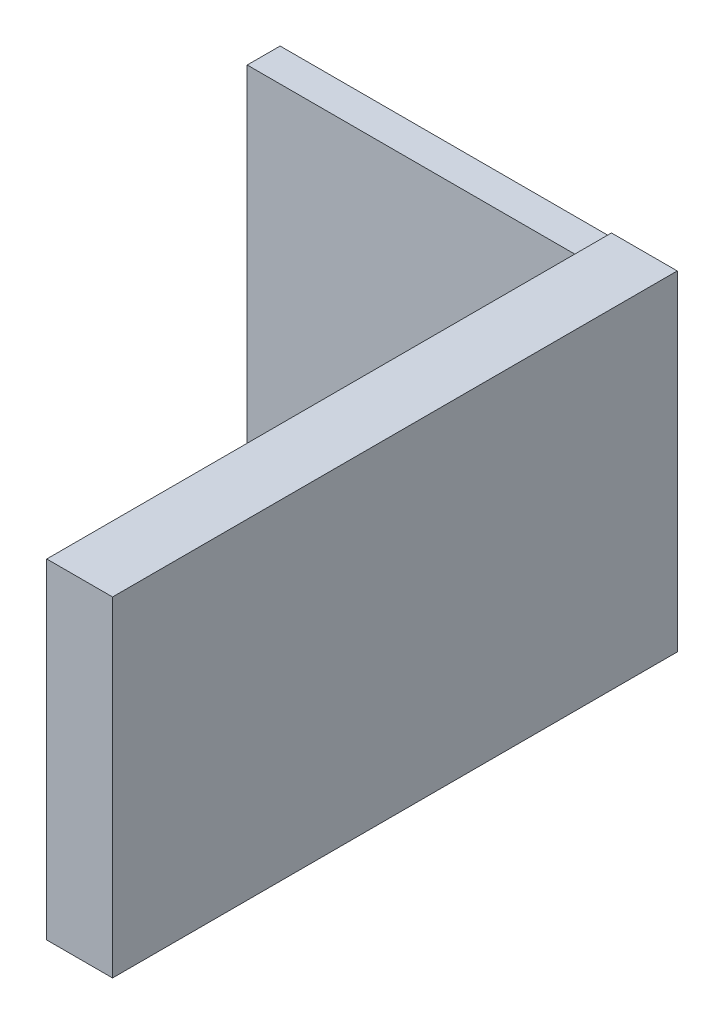
ISO-10303-21;
HEADER;
FILE_DESCRIPTION(('STEP AP214'),'2;1');
FILE_NAME('part.step','',(''),(''),'','','');
FILE_SCHEMA(('AUTOMOTIVE_DESIGN { 1 0 10303 214 1 1 1 1 }'));
ENDSEC;
DATA;
#1=APPLICATION_CONTEXT('core data for automotive mechanical design processes');
#2=APPLICATION_PROTOCOL_DEFINITION('international standard','automotive_design',2000,#1);
#3=PRODUCT_CONTEXT('',#1,'mechanical');
#4=PRODUCT('Part','Part','',(#3));
#5=PRODUCT_RELATED_PRODUCT_CATEGORY('part','',(#4));
#6=PRODUCT_DEFINITION_FORMATION('','',#4);
#7=PRODUCT_DEFINITION_CONTEXT('part definition',#1,'design');
#8=PRODUCT_DEFINITION('design','',#6,#7);
#9=PRODUCT_DEFINITION_SHAPE('','',#8);
#10=(LENGTH_UNIT() NAMED_UNIT(*) SI_UNIT(.MILLI.,.METRE.));
#11=(NAMED_UNIT(*) PLANE_ANGLE_UNIT() SI_UNIT($,.RADIAN.));
#12=(NAMED_UNIT(*) SI_UNIT($,.STERADIAN.) SOLID_ANGLE_UNIT());
#13=UNCERTAINTY_MEASURE_WITH_UNIT(LENGTH_MEASURE(1.E-05),#10,'distance_accuracy_value','');
#14=(GEOMETRIC_REPRESENTATION_CONTEXT(3) GLOBAL_UNCERTAINTY_ASSIGNED_CONTEXT((#13)) GLOBAL_UNIT_ASSIGNED_CONTEXT((#10,
#11,#12)) REPRESENTATION_CONTEXT('',''));
#15=CARTESIAN_POINT('',(0.,0.,0.));
#16=DIRECTION('',(0.,0.,1.));
#17=DIRECTION('',(1.,0.,0.));
#18=AXIS2_PLACEMENT_3D('',#15,#16,#17);
#19=CARTESIAN_POINT('',(-8.97379582442876,1.04757520960053,1.));
#20=DIRECTION('',(-1.,0.,0.));
#21=DIRECTION('',(0.,-1.,0.));
#22=AXIS2_PLACEMENT_3D('',#19,#20,#21);
#23=PLANE('',#22);
#24=DIRECTION('',(0.,1.,0.));
#25=VECTOR('',#24,1.);
#26=CARTESIAN_POINT('',(-8.97379582442876,1.04757520960053,0.));
#27=LINE('',#26,#25);
#28=CARTESIAN_POINT('',(-8.97379582442876,-8.95242479039947,0.));
#29=VERTEX_POINT('',#28);
#30=CARTESIAN_POINT('',(-8.97379582442876,-8.93866778461039,0.));
#31=VERTEX_POINT('',#30);
#32=EDGE_CURVE('E154',#29,#31,#27,.T.);
#33=ORIENTED_EDGE('',*,*,#32,.T.);
#34=DIRECTION('',(0.,0.,1.));
#35=VECTOR('',#34,1.);
#36=CARTESIAN_POINT('',(-8.97379582442876,-8.93866778461039,-0.0709123591491347));
#37=LINE('',#36,#35);
#38=CARTESIAN_POINT('',(-8.97379582442876,-8.93866778461039,1.));
#39=VERTEX_POINT('',#38);
#40=EDGE_CURVE('E11',#31,#39,#37,.T.);
#41=ORIENTED_EDGE('',*,*,#40,.T.);
#42=DIRECTION('',(0.,1.,0.));
#43=VECTOR('',#42,1.);
#44=CARTESIAN_POINT('',(-8.97379582442876,1.04757520960053,1.));
#45=LINE('',#44,#43);
#46=CARTESIAN_POINT('',(-8.97379582442876,-8.95242479039947,1.));
#47=VERTEX_POINT('',#46);
#48=EDGE_CURVE('E160',#47,#39,#45,.T.);
#49=ORIENTED_EDGE('',*,*,#48,.F.);
#50=DIRECTION('',(0.,0.,-1.));
#51=VECTOR('',#50,1.);
#52=CARTESIAN_POINT('',(-8.97379582442876,-8.95242479039947,1.));
#53=LINE('',#52,#51);
#54=EDGE_CURVE('E170',#47,#29,#53,.T.);
#55=ORIENTED_EDGE('',*,*,#54,.T.);
#56=EDGE_LOOP('',(#33,#41,#49,#55));
#57=FACE_BOUND('',#56,.T.);
#58=ADVANCED_FACE('F39',(#57),#23,.F.);
#59=CARTESIAN_POINT('',(-18.9737958244288,1.04757520960053,1.));
#60=DIRECTION('',(0.,-1.,0.));
#61=DIRECTION('',(0.,0.,-1.));
#62=AXIS2_PLACEMENT_3D('',#59,#60,#61);
#63=PLANE('',#62);
#64=DIRECTION('',(-1.,0.,0.));
#65=VECTOR('',#64,1.);
#66=CARTESIAN_POINT('',(-18.9737958244288,1.04757520960053,0.));
#67=LINE('',#66,#65);
#68=CARTESIAN_POINT('',(-8.97379582442876,1.04757520960053,0.));
#69=VERTEX_POINT('',#68);
#70=CARTESIAN_POINT('',(-18.9737958244288,1.04757520960053,0.));
#71=VERTEX_POINT('',#70);
#72=EDGE_CURVE('E174',#69,#71,#67,.T.);
#73=ORIENTED_EDGE('',*,*,#72,.T.);
#74=DIRECTION('',(0.,0.,-1.));
#75=VECTOR('',#74,1.);
#76=CARTESIAN_POINT('',(-18.9737958244288,1.04757520960053,1.));
#77=LINE('',#76,#75);
#78=CARTESIAN_POINT('',(-18.9737958244288,1.04757520960053,1.));
#79=VERTEX_POINT('',#78);
#80=EDGE_CURVE('E186',#79,#71,#77,.T.);
#81=ORIENTED_EDGE('',*,*,#80,.F.);
#82=DIRECTION('',(-1.,0.,0.));
#83=VECTOR('',#82,1.);
#84=CARTESIAN_POINT('',(-18.9737958244288,1.04757520960053,1.));
#85=LINE('',#84,#83);
#86=CARTESIAN_POINT('',(-8.97379582442876,1.04757520960053,1.));
#87=VERTEX_POINT('',#86);
#88=EDGE_CURVE('E87',#87,#79,#85,.T.);
#89=ORIENTED_EDGE('',*,*,#88,.F.);
#90=DIRECTION('',(0.,0.,-1.));
#91=VECTOR('',#90,1.);
#92=CARTESIAN_POINT('',(-8.97379582442876,1.04757520960053,1.));
#93=LINE('',#92,#91);
#94=EDGE_CURVE('E42',#87,#69,#93,.T.);
#95=ORIENTED_EDGE('',*,*,#94,.T.);
#96=EDGE_LOOP('',(#73,#81,#89,#95));
#97=FACE_BOUND('',#96,.T.);
#98=ADVANCED_FACE('F195',(#97),#63,.F.);
#99=CARTESIAN_POINT('',(-18.9737958244288,1.04757520960053,1.));
#100=DIRECTION('',(1.,0.,0.));
#101=DIRECTION('',(0.,0.,-1.));
#102=AXIS2_PLACEMENT_3D('',#99,#100,#101);
#103=PLANE('',#102);
#104=DIRECTION('',(0.,-1.,0.));
#105=VECTOR('',#104,1.);
#106=CARTESIAN_POINT('',(-18.9737958244288,1.04757520960053,0.));
#107=LINE('',#106,#105);
#108=CARTESIAN_POINT('',(-18.9737958244288,-8.95242479039947,0.));
#109=VERTEX_POINT('',#108);
#110=EDGE_CURVE('E177',#71,#109,#107,.T.);
#111=ORIENTED_EDGE('',*,*,#110,.T.);
#112=DIRECTION('',(0.,0.,-1.));
#113=VECTOR('',#112,1.);
#114=CARTESIAN_POINT('',(-18.9737958244288,-8.95242479039947,1.));
#115=LINE('',#114,#113);
#116=CARTESIAN_POINT('',(-18.9737958244288,-8.95242479039947,1.));
#117=VERTEX_POINT('',#116);
#118=EDGE_CURVE('E184',#117,#109,#115,.T.);
#119=ORIENTED_EDGE('',*,*,#118,.F.);
#120=DIRECTION('',(0.,-1.,0.));
#121=VECTOR('',#120,1.);
#122=CARTESIAN_POINT('',(-18.9737958244288,1.04757520960053,1.));
#123=LINE('',#122,#121);
#124=EDGE_CURVE('E166',#79,#117,#123,.T.);
#125=ORIENTED_EDGE('',*,*,#124,.F.);
#126=ORIENTED_EDGE('',*,*,#80,.T.);
#127=EDGE_LOOP('',(#111,#119,#125,#126));
#128=FACE_BOUND('',#127,.T.);
#129=ADVANCED_FACE('F214',(#128),#103,.F.);
#130=CARTESIAN_POINT('',(-18.9737958244288,-8.95242479039947,1.));
#131=DIRECTION('',(0.,1.,0.));
#132=DIRECTION('',(0.,0.,1.));
#133=AXIS2_PLACEMENT_3D('',#130,#131,#132);
#134=PLANE('',#133);
#135=DIRECTION('',(1.,0.,0.));
#136=VECTOR('',#135,1.);
#137=CARTESIAN_POINT('',(-18.9737958244288,-8.95242479039947,0.));
#138=LINE('',#137,#136);
#139=EDGE_CURVE('E82',#109,#29,#138,.T.);
#140=ORIENTED_EDGE('',*,*,#139,.T.);
#141=ORIENTED_EDGE('',*,*,#54,.F.);
#142=DIRECTION('',(1.,0.,0.));
#143=VECTOR('',#142,1.);
#144=CARTESIAN_POINT('',(-18.9737958244288,-8.95242479039947,1.));
#145=LINE('',#144,#143);
#146=EDGE_CURVE('E65',#117,#47,#145,.T.);
#147=ORIENTED_EDGE('',*,*,#146,.F.);
#148=ORIENTED_EDGE('',*,*,#118,.T.);
#149=EDGE_LOOP('',(#140,#141,#147,#148));
#150=FACE_BOUND('',#149,.T.);
#151=ADVANCED_FACE('F215',(#150),#134,.F.);
#152=CARTESIAN_POINT('',(0.,0.,1.));
#153=DIRECTION('',(0.,0.,1.));
#154=DIRECTION('',(1.,0.,0.));
#155=AXIS2_PLACEMENT_3D('',#152,#153,#154);
#156=PLANE('',#155);
#157=ORIENTED_EDGE('',*,*,#48,.T.);
#158=EDGE_CURVE('E163',#39,#87,#45,.T.);
#159=ORIENTED_EDGE('',*,*,#158,.T.);
#160=ORIENTED_EDGE('',*,*,#88,.T.);
#161=ORIENTED_EDGE('',*,*,#124,.T.);
#162=ORIENTED_EDGE('',*,*,#146,.T.);
#163=EDGE_LOOP('',(#157,#159,#160,#161,#162));
#164=FACE_BOUND('',#163,.T.);
#165=ADVANCED_FACE('F201',(#164),#156,.T.);
#166=CARTESIAN_POINT('',(0.,0.,0.));
#167=DIRECTION('',(0.,0.,1.));
#168=DIRECTION('',(1.,0.,0.));
#169=AXIS2_PLACEMENT_3D('',#166,#167,#168);
#170=PLANE('',#169);
#171=ORIENTED_EDGE('',*,*,#32,.F.);
#172=ORIENTED_EDGE('',*,*,#139,.F.);
#173=ORIENTED_EDGE('',*,*,#110,.F.);
#174=ORIENTED_EDGE('',*,*,#72,.F.);
#175=EDGE_CURVE('E150',#31,#69,#27,.T.);
#176=ORIENTED_EDGE('',*,*,#175,.F.);
#177=EDGE_LOOP('',(#171,#172,#173,#174,#176));
#178=FACE_BOUND('',#177,.T.);
#179=ADVANCED_FACE('F212',(#178),#170,.F.);
#180=CARTESIAN_POINT('',(-8.97379582442876,0.,0.));
#181=DIRECTION('',(1.,0.,0.));
#182=DIRECTION('',(0.,1.,0.));
#183=AXIS2_PLACEMENT_3D('',#180,#181,#182);
#184=PLANE('',#183);
#185=CARTESIAN_POINT('',(-8.97379582442876,-8.93866778461039,-0.0709123591491347));
#186=VERTEX_POINT('',#185);
#187=EDGE_CURVE('E49',#186,#31,#37,.T.);
#188=ORIENTED_EDGE('',*,*,#187,.T.);
#189=ORIENTED_EDGE('',*,*,#175,.T.);
#190=ORIENTED_EDGE('',*,*,#94,.F.);
#191=ORIENTED_EDGE('',*,*,#158,.F.);
#192=CARTESIAN_POINT('',(-8.97379582442876,-8.93866778461039,17.0932589056747));
#193=VERTEX_POINT('',#192);
#194=EDGE_CURVE('E50',#39,#193,#37,.T.);
#195=ORIENTED_EDGE('',*,*,#194,.T.);
#196=DIRECTION('',(0.,-1.,0.));
#197=VECTOR('',#196,1.);
#198=CARTESIAN_POINT('',(-8.97379582442876,1.09141463971163,17.0932589056747));
#199=LINE('',#198,#197);
#200=CARTESIAN_POINT('',(-8.97379582442876,1.09141463971163,17.0932589056747));
#201=VERTEX_POINT('',#200);
#202=EDGE_CURVE('E325',#201,#193,#199,.T.);
#203=ORIENTED_EDGE('',*,*,#202,.F.);
#204=DIRECTION('',(0.,0.,1.));
#205=VECTOR('',#204,1.);
#206=CARTESIAN_POINT('',(-8.97379582442876,1.09141463971163,-0.0709123591491334));
#207=LINE('',#206,#205);
#208=CARTESIAN_POINT('',(-8.97379582442876,1.09141463971163,-0.0709123591491334));
#209=VERTEX_POINT('',#208);
#210=EDGE_CURVE('E148',#209,#201,#207,.T.);
#211=ORIENTED_EDGE('',*,*,#210,.F.);
#212=DIRECTION('',(0.,-1.,0.));
#213=VECTOR('',#212,1.);
#214=CARTESIAN_POINT('',(-8.97379582442876,1.09141463971163,-0.0709123591491334));
#215=LINE('',#214,#213);
#216=EDGE_CURVE('E144',#209,#186,#215,.T.);
#217=ORIENTED_EDGE('',*,*,#216,.T.);
#218=EDGE_LOOP('',(#188,#189,#190,#191,#195,#203,#211,#217));
#219=FACE_BOUND('',#218,.T.);
#220=ADVANCED_FACE('F199',(#219),#184,.F.);
#221=CARTESIAN_POINT('',(-6.97379582442876,1.09141463971163,-0.0709123591491334));
#222=DIRECTION('',(0.,-1.,0.));
#223=DIRECTION('',(1.,0.,0.));
#224=AXIS2_PLACEMENT_3D('',#221,#222,#223);
#225=PLANE('',#224);
#226=ORIENTED_EDGE('',*,*,#210,.T.);
#227=DIRECTION('',(-1.,0.,0.));
#228=VECTOR('',#227,1.);
#229=CARTESIAN_POINT('',(-6.97379582442876,1.09141463971163,17.0932589056747));
#230=LINE('',#229,#228);
#231=CARTESIAN_POINT('',(-6.97379582442876,1.09141463971163,17.0932589056747));
#232=VERTEX_POINT('',#231);
#233=EDGE_CURVE('E127',#232,#201,#230,.T.);
#234=ORIENTED_EDGE('',*,*,#233,.F.);
#235=DIRECTION('',(0.,0.,1.));
#236=VECTOR('',#235,1.);
#237=CARTESIAN_POINT('',(-6.97379582442876,1.09141463971163,-0.0709123591491334));
#238=LINE('',#237,#236);
#239=CARTESIAN_POINT('',(-6.97379582442876,1.09141463971163,-0.0709123591491334));
#240=VERTEX_POINT('',#239);
#241=EDGE_CURVE('E135',#240,#232,#238,.T.);
#242=ORIENTED_EDGE('',*,*,#241,.F.);
#243=DIRECTION('',(-1.,0.,0.));
#244=VECTOR('',#243,1.);
#245=CARTESIAN_POINT('',(-6.97379582442876,1.09141463971163,-0.0709123591491334));
#246=LINE('',#245,#244);
#247=EDGE_CURVE('E312',#240,#209,#246,.T.);
#248=ORIENTED_EDGE('',*,*,#247,.T.);
#249=EDGE_LOOP('',(#226,#234,#242,#248));
#250=FACE_BOUND('',#249,.T.);
#251=ADVANCED_FACE('F146',(#250),#225,.F.);
#252=CARTESIAN_POINT('',(-6.97379582442876,1.09141463971163,17.0932589056747));
#253=DIRECTION('',(0.,0.,-1.));
#254=DIRECTION('',(-1.,0.,0.));
#255=AXIS2_PLACEMENT_3D('',#252,#253,#254);
#256=PLANE('',#255);
#257=ORIENTED_EDGE('',*,*,#202,.T.);
#258=DIRECTION('',(-1.,0.,0.));
#259=VECTOR('',#258,1.);
#260=CARTESIAN_POINT('',(-6.97379582442876,-8.93866778461039,17.0932589056747));
#261=LINE('',#260,#259);
#262=CARTESIAN_POINT('',(-6.97379582442876,-8.93866778461039,17.0932589056747));
#263=VERTEX_POINT('',#262);
#264=EDGE_CURVE('E129',#263,#193,#261,.T.);
#265=ORIENTED_EDGE('',*,*,#264,.F.);
#266=DIRECTION('',(0.,-1.,0.));
#267=VECTOR('',#266,1.);
#268=CARTESIAN_POINT('',(-6.97379582442876,1.09141463971163,17.0932589056747));
#269=LINE('',#268,#267);
#270=EDGE_CURVE('E122',#232,#263,#269,.T.);
#271=ORIENTED_EDGE('',*,*,#270,.F.);
#272=ORIENTED_EDGE('',*,*,#233,.T.);
#273=EDGE_LOOP('',(#257,#265,#271,#272));
#274=FACE_BOUND('',#273,.T.);
#275=ADVANCED_FACE('F125',(#274),#256,.F.);
#276=CARTESIAN_POINT('',(-6.97379582442876,-8.93866778461039,-0.0709123591491347));
#277=DIRECTION('',(0.,-1.,0.));
#278=DIRECTION('',(1.,0.,0.));
#279=AXIS2_PLACEMENT_3D('',#276,#277,#278);
#280=PLANE('',#279);
#281=ORIENTED_EDGE('',*,*,#187,.F.);
#282=DIRECTION('',(-1.,0.,0.));
#283=VECTOR('',#282,1.);
#284=CARTESIAN_POINT('',(-6.97379582442876,-8.93866778461039,-0.0709123591491347));
#285=LINE('',#284,#283);
#286=CARTESIAN_POINT('',(-6.97379582442876,-8.93866778461039,-0.0709123591491347));
#287=VERTEX_POINT('',#286);
#288=EDGE_CURVE('E156',#287,#186,#285,.T.);
#289=ORIENTED_EDGE('',*,*,#288,.F.);
#290=DIRECTION('',(0.,0.,1.));
#291=VECTOR('',#290,1.);
#292=CARTESIAN_POINT('',(-6.97379582442876,-8.93866778461039,-0.0709123591491347));
#293=LINE('',#292,#291);
#294=EDGE_CURVE('E134',#287,#263,#293,.T.);
#295=ORIENTED_EDGE('',*,*,#294,.T.);
#296=ORIENTED_EDGE('',*,*,#264,.T.);
#297=ORIENTED_EDGE('',*,*,#194,.F.);
#298=ORIENTED_EDGE('',*,*,#40,.F.);
#299=EDGE_LOOP('',(#281,#289,#295,#296,#297,#298));
#300=FACE_BOUND('',#299,.T.);
#301=ADVANCED_FACE('F207',(#300),#280,.T.);
#302=CARTESIAN_POINT('',(-6.97379582442876,1.09141463971163,-0.0709123591491334));
#303=DIRECTION('',(0.,0.,-1.));
#304=DIRECTION('',(0.,1.,0.));
#305=AXIS2_PLACEMENT_3D('',#302,#303,#304);
#306=PLANE('',#305);
#307=ORIENTED_EDGE('',*,*,#216,.F.);
#308=ORIENTED_EDGE('',*,*,#247,.F.);
#309=DIRECTION('',(0.,-1.,0.));
#310=VECTOR('',#309,1.);
#311=CARTESIAN_POINT('',(-6.97379582442876,1.09141463971163,-0.0709123591491334));
#312=LINE('',#311,#310);
#313=EDGE_CURVE('E141',#240,#287,#312,.T.);
#314=ORIENTED_EDGE('',*,*,#313,.T.);
#315=ORIENTED_EDGE('',*,*,#288,.T.);
#316=EDGE_LOOP('',(#307,#308,#314,#315));
#317=FACE_BOUND('',#316,.T.);
#318=ADVANCED_FACE('F287',(#317),#306,.T.);
#319=CARTESIAN_POINT('',(-6.97379582442876,0.,0.));
#320=DIRECTION('',(1.,0.,0.));
#321=DIRECTION('',(0.,1.,0.));
#322=AXIS2_PLACEMENT_3D('',#319,#320,#321);
#323=PLANE('',#322);
#324=ORIENTED_EDGE('',*,*,#241,.T.);
#325=ORIENTED_EDGE('',*,*,#270,.T.);
#326=ORIENTED_EDGE('',*,*,#294,.F.);
#327=ORIENTED_EDGE('',*,*,#313,.F.);
#328=EDGE_LOOP('',(#324,#325,#326,#327));
#329=FACE_BOUND('',#328,.T.);
#330=ADVANCED_FACE('F139',(#329),#323,.T.);
#331=CLOSED_SHELL('',(#58,#98,#129,#151,#165,#179,#220,#251,#275,#301,#318,#330));
#332=MANIFOLD_SOLID_BREP('B2',#331);
#333=ADVANCED_BREP_SHAPE_REPRESENTATION('',(#18,#332),#14);
#334=SHAPE_DEFINITION_REPRESENTATION(#9,#333);
ENDSEC;
END-ISO-10303-21;
